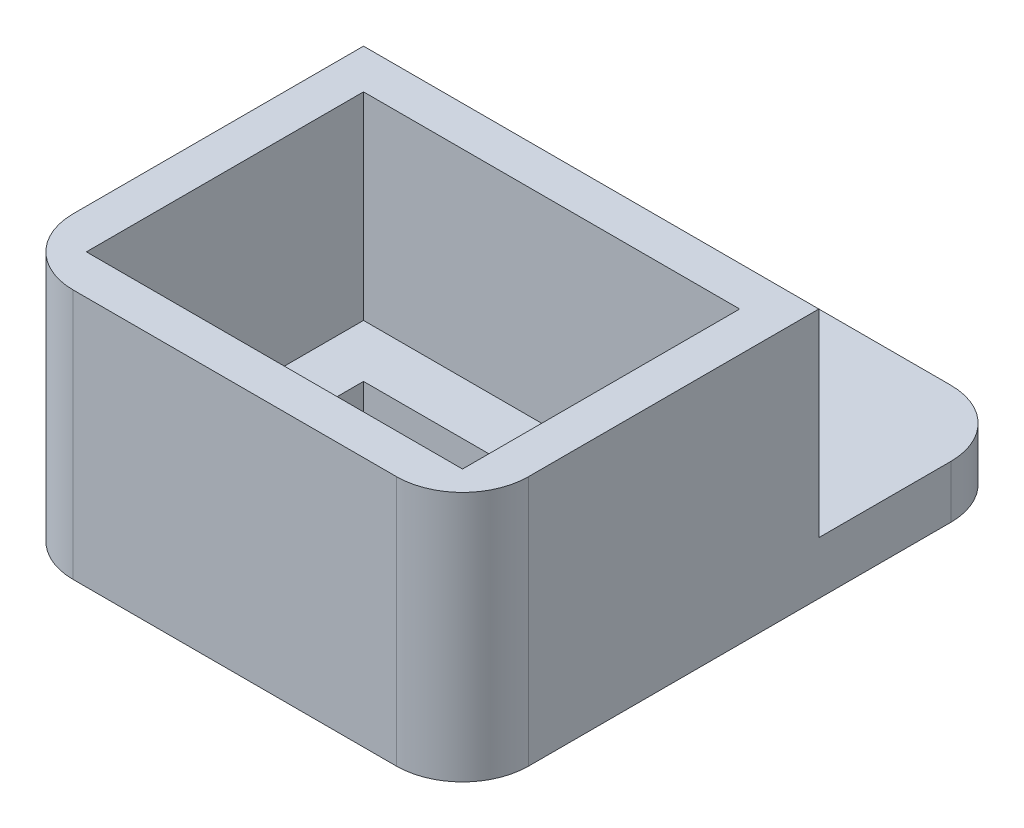
ISO-10303-21;
HEADER;
FILE_DESCRIPTION(('STEP AP214'),'2;1');
FILE_NAME('part.step','',(''),(''),'','','');
FILE_SCHEMA(('AUTOMOTIVE_DESIGN { 1 0 10303 214 1 1 1 1 }'));
ENDSEC;
DATA;
#1=APPLICATION_CONTEXT('core data for automotive mechanical design processes');
#2=APPLICATION_PROTOCOL_DEFINITION('international standard','automotive_design',2000,#1);
#3=PRODUCT_CONTEXT('',#1,'mechanical');
#4=PRODUCT('Part','Part','',(#3));
#5=PRODUCT_RELATED_PRODUCT_CATEGORY('part','',(#4));
#6=PRODUCT_DEFINITION_FORMATION('','',#4);
#7=PRODUCT_DEFINITION_CONTEXT('part definition',#1,'design');
#8=PRODUCT_DEFINITION('design','',#6,#7);
#9=PRODUCT_DEFINITION_SHAPE('','',#8);
#10=(LENGTH_UNIT() NAMED_UNIT(*) SI_UNIT(.MILLI.,.METRE.));
#11=(NAMED_UNIT(*) PLANE_ANGLE_UNIT() SI_UNIT($,.RADIAN.));
#12=(NAMED_UNIT(*) SI_UNIT($,.STERADIAN.) SOLID_ANGLE_UNIT());
#13=UNCERTAINTY_MEASURE_WITH_UNIT(LENGTH_MEASURE(1.E-05),#10,'distance_accuracy_value','');
#14=(GEOMETRIC_REPRESENTATION_CONTEXT(3) GLOBAL_UNCERTAINTY_ASSIGNED_CONTEXT((#13)) GLOBAL_UNIT_ASSIGNED_CONTEXT((#10,
#11,#12)) REPRESENTATION_CONTEXT('',''));
#15=CARTESIAN_POINT('',(0.,0.,0.));
#16=DIRECTION('',(0.,0.,1.));
#17=DIRECTION('',(1.,0.,0.));
#18=AXIS2_PLACEMENT_3D('',#15,#16,#17);
#19=CARTESIAN_POINT('',(0.,115.002,367.5));
#20=DIRECTION('',(0.,-1.,0.));
#21=DIRECTION('',(0.,0.,-1.));
#22=AXIS2_PLACEMENT_3D('',#19,#20,#21);
#23=CYLINDRICAL_SURFACE('',#22,1.65);
#24=CARTESIAN_POINT('',(0.,115.,367.5));
#25=DIRECTION('',(0.,1.,0.));
#26=DIRECTION('',(0.,0.,1.));
#27=AXIS2_PLACEMENT_3D('',#24,#25,#26);
#28=CIRCLE('',#27,1.65);
#29=CARTESIAN_POINT('',(0.,115.,369.15));
#30=VERTEX_POINT('',#29);
#31=EDGE_CURVE('E241',#30,#30,#28,.F.);
#32=ORIENTED_EDGE('',*,*,#31,.F.);
#33=EDGE_LOOP('',(#32));
#34=FACE_BOUND('',#33,.T.);
#35=CARTESIAN_POINT('',(0.,113.,367.5));
#36=DIRECTION('',(0.,-1.,0.));
#37=DIRECTION('',(1.,0.,0.));
#38=AXIS2_PLACEMENT_3D('',#35,#36,#37);
#39=CIRCLE('',#38,1.65);
#40=CARTESIAN_POINT('',(1.65000000000008,113.,367.5));
#41=VERTEX_POINT('',#40);
#42=EDGE_CURVE('E589',#41,#41,#39,.T.);
#43=ORIENTED_EDGE('',*,*,#42,.T.);
#44=EDGE_LOOP('',(#43));
#45=FACE_BOUND('',#44,.T.);
#46=ADVANCED_FACE('F16',(#34,#45),#23,.F.);
#47=CARTESIAN_POINT('',(0.,115.,381.));
#48=DIRECTION('',(0.,-1.,0.));
#49=DIRECTION('',(1.,0.,0.));
#50=AXIS2_PLACEMENT_3D('',#47,#48,#49);
#51=PLANE('',#50);
#52=DIRECTION('',(1.,0.,0.));
#53=VECTOR('',#52,1.);
#54=CARTESIAN_POINT('',(-3.51074537812937,115.,382.));
#55=LINE('',#54,#53);
#56=CARTESIAN_POINT('',(-10.25,115.,382.));
#57=VERTEX_POINT('',#56);
#58=CARTESIAN_POINT('',(10.25,115.,382.));
#59=VERTEX_POINT('',#58);
#60=EDGE_CURVE('E258',#57,#59,#55,.T.);
#61=ORIENTED_EDGE('',*,*,#60,.T.);
#62=DIRECTION('',(0.,0.,-1.));
#63=VECTOR('',#62,1.);
#64=CARTESIAN_POINT('',(10.25,115.,390.450173222865));
#65=LINE('',#64,#63);
#66=CARTESIAN_POINT('',(10.25,115.,395.));
#67=VERTEX_POINT('',#66);
#68=EDGE_CURVE('E313',#67,#59,#65,.T.);
#69=ORIENTED_EDGE('',*,*,#68,.F.);
#70=DIRECTION('',(1.,0.,0.));
#71=VECTOR('',#70,1.);
#72=CARTESIAN_POINT('',(-3.51074537812937,115.,395.));
#73=LINE('',#72,#71);
#74=CARTESIAN_POINT('',(-10.25,115.,395.));
#75=VERTEX_POINT('',#74);
#76=EDGE_CURVE('E309',#75,#67,#73,.T.);
#77=ORIENTED_EDGE('',*,*,#76,.F.);
#78=DIRECTION('',(0.,0.,-1.));
#79=VECTOR('',#78,1.);
#80=CARTESIAN_POINT('',(-10.25,115.,393.950173222865));
#81=LINE('',#80,#79);
#82=EDGE_CURVE('E305',#75,#57,#81,.T.);
#83=ORIENTED_EDGE('',*,*,#82,.T.);
#84=EDGE_LOOP('',(#61,#69,#77,#83));
#85=FACE_BOUND('',#84,.T.);
#86=DIRECTION('',(0.,0.,-1.));
#87=VECTOR('',#86,1.);
#88=CARTESIAN_POINT('',(-14.25,115.,392.5));
#89=LINE('',#88,#87);
#90=CARTESIAN_POINT('',(-14.25,115.,399.));
#91=VERTEX_POINT('',#90);
#92=CARTESIAN_POINT('',(-14.25,115.,378.));
#93=VERTEX_POINT('',#92);
#94=EDGE_CURVE('E240',#91,#93,#89,.T.);
#95=ORIENTED_EDGE('',*,*,#94,.F.);
#96=DIRECTION('',(1.,0.,0.));
#97=VECTOR('',#96,1.);
#98=CARTESIAN_POINT('',(-3.56886209920049,115.,399.));
#99=LINE('',#98,#97);
#100=CARTESIAN_POINT('',(14.25,115.,399.));
#101=VERTEX_POINT('',#100);
#102=EDGE_CURVE('E191',#91,#101,#99,.T.);
#103=ORIENTED_EDGE('',*,*,#102,.T.);
#104=DIRECTION('',(0.,0.,-1.));
#105=VECTOR('',#104,1.);
#106=CARTESIAN_POINT('',(14.25,115.,389.));
#107=LINE('',#106,#105);
#108=CARTESIAN_POINT('',(14.25,115.,378.));
#109=VERTEX_POINT('',#108);
#110=EDGE_CURVE('E244',#101,#109,#107,.T.);
#111=ORIENTED_EDGE('',*,*,#110,.T.);
#112=DIRECTION('',(1.,0.,0.));
#113=VECTOR('',#112,1.);
#114=CARTESIAN_POINT('',(-3.21599574801192,115.,378.));
#115=LINE('',#114,#113);
#116=EDGE_CURVE('E209',#93,#109,#115,.T.);
#117=ORIENTED_EDGE('',*,*,#116,.F.);
#118=EDGE_LOOP('',(#95,#103,#111,#117));
#119=FACE_BOUND('',#118,.T.);
#120=ADVANCED_FACE('F434',(#85,#119),#51,.F.);
#121=ORIENTED_EDGE('',*,*,#31,.T.);
#122=EDGE_LOOP('',(#121));
#123=FACE_BOUND('',#122,.T.);
#124=DIRECTION('',(0.,0.,-1.));
#125=VECTOR('',#124,1.);
#126=CARTESIAN_POINT('',(17.25,115.,389.));
#127=LINE('',#126,#125);
#128=CARTESIAN_POINT('',(17.25,115.,375.));
#129=VERTEX_POINT('',#128);
#130=CARTESIAN_POINT('',(17.25,115.,365.));
#131=VERTEX_POINT('',#130);
#132=EDGE_CURVE('E317',#129,#131,#127,.T.);
#133=ORIENTED_EDGE('',*,*,#132,.T.);
#134=CARTESIAN_POINT('',(12.25,115.,365.));
#135=DIRECTION('',(0.,-1.,0.));
#136=DIRECTION('',(0.,0.,-1.));
#137=AXIS2_PLACEMENT_3D('',#134,#135,#136);
#138=CIRCLE('',#137,5.);
#139=CARTESIAN_POINT('',(12.2500000000001,115.,360.));
#140=VERTEX_POINT('',#139);
#141=EDGE_CURVE('E49',#131,#140,#138,.F.);
#142=ORIENTED_EDGE('',*,*,#141,.T.);
#143=DIRECTION('',(-1.,0.,0.));
#144=VECTOR('',#143,1.);
#145=CARTESIAN_POINT('',(180.,115.,360.));
#146=LINE('',#145,#144);
#147=CARTESIAN_POINT('',(-12.2499999999999,115.,360.));
#148=VERTEX_POINT('',#147);
#149=EDGE_CURVE('E274',#140,#148,#146,.T.);
#150=ORIENTED_EDGE('',*,*,#149,.T.);
#151=CARTESIAN_POINT('',(-12.25,115.,365.));
#152=DIRECTION('',(0.,-1.,0.));
#153=DIRECTION('',(0.,0.,-1.));
#154=AXIS2_PLACEMENT_3D('',#151,#152,#153);
#155=CIRCLE('',#154,5.);
#156=CARTESIAN_POINT('',(-17.25,115.,365.));
#157=VERTEX_POINT('',#156);
#158=EDGE_CURVE('E37',#148,#157,#155,.F.);
#159=ORIENTED_EDGE('',*,*,#158,.T.);
#160=DIRECTION('',(0.,0.,-1.));
#161=VECTOR('',#160,1.);
#162=CARTESIAN_POINT('',(-17.25,115.,392.5));
#163=LINE('',#162,#161);
#164=CARTESIAN_POINT('',(-17.25,115.,375.));
#165=VERTEX_POINT('',#164);
#166=EDGE_CURVE('E320',#165,#157,#163,.T.);
#167=ORIENTED_EDGE('',*,*,#166,.F.);
#168=DIRECTION('',(-1.,0.,0.));
#169=VECTOR('',#168,1.);
#170=CARTESIAN_POINT('',(180.,115.,375.));
#171=LINE('',#170,#169);
#172=EDGE_CURVE('E247',#129,#165,#171,.T.);
#173=ORIENTED_EDGE('',*,*,#172,.F.);
#174=EDGE_LOOP('',(#133,#142,#150,#159,#167,#173));
#175=FACE_BOUND('',#174,.T.);
#176=ADVANCED_FACE('F387',(#123,#175),#51,.F.);
#177=CARTESIAN_POINT('',(-3.51074537812937,111.,382.));
#178=DIRECTION('',(0.,0.,1.));
#179=DIRECTION('',(1.,0.,0.));
#180=AXIS2_PLACEMENT_3D('',#177,#178,#179);
#181=PLANE('',#180);
#182=ORIENTED_EDGE('',*,*,#60,.F.);
#183=DIRECTION('',(0.,1.,0.));
#184=VECTOR('',#183,1.);
#185=CARTESIAN_POINT('',(-10.25,111.,382.));
#186=LINE('',#185,#184);
#187=CARTESIAN_POINT('',(-10.25,111.,382.));
#188=VERTEX_POINT('',#187);
#189=EDGE_CURVE('E335',#188,#57,#186,.T.);
#190=ORIENTED_EDGE('',*,*,#189,.F.);
#191=DIRECTION('',(1.,0.,0.));
#192=VECTOR('',#191,1.);
#193=CARTESIAN_POINT('',(-3.51074537812937,111.,382.));
#194=LINE('',#193,#192);
#195=CARTESIAN_POINT('',(10.25,111.,382.));
#196=VERTEX_POINT('',#195);
#197=EDGE_CURVE('E273',#188,#196,#194,.T.);
#198=ORIENTED_EDGE('',*,*,#197,.T.);
#199=DIRECTION('',(0.,1.,0.));
#200=VECTOR('',#199,1.);
#201=CARTESIAN_POINT('',(10.25,111.,382.));
#202=LINE('',#201,#200);
#203=EDGE_CURVE('E301',#196,#59,#202,.T.);
#204=ORIENTED_EDGE('',*,*,#203,.T.);
#205=EDGE_LOOP('',(#182,#190,#198,#204));
#206=FACE_BOUND('',#205,.T.);
#207=ADVANCED_FACE('F479',(#206),#181,.T.);
#208=CARTESIAN_POINT('',(-10.25,111.,393.950173222865));
#209=DIRECTION('',(1.,0.,0.));
#210=DIRECTION('',(0.,0.,-1.));
#211=AXIS2_PLACEMENT_3D('',#208,#209,#210);
#212=PLANE('',#211);
#213=ORIENTED_EDGE('',*,*,#82,.F.);
#214=DIRECTION('',(0.,1.,0.));
#215=VECTOR('',#214,1.);
#216=CARTESIAN_POINT('',(-10.25,111.,395.));
#217=LINE('',#216,#215);
#218=CARTESIAN_POINT('',(-10.25,111.,395.));
#219=VERTEX_POINT('',#218);
#220=EDGE_CURVE('E332',#219,#75,#217,.T.);
#221=ORIENTED_EDGE('',*,*,#220,.F.);
#222=DIRECTION('',(0.,0.,-1.));
#223=VECTOR('',#222,1.);
#224=CARTESIAN_POINT('',(-10.25,111.,393.950173222865));
#225=LINE('',#224,#223);
#226=EDGE_CURVE('E278',#219,#188,#225,.T.);
#227=ORIENTED_EDGE('',*,*,#226,.T.);
#228=ORIENTED_EDGE('',*,*,#189,.T.);
#229=EDGE_LOOP('',(#213,#221,#227,#228));
#230=FACE_BOUND('',#229,.T.);
#231=ADVANCED_FACE('F475',(#230),#212,.T.);
#232=CARTESIAN_POINT('',(-3.51074537812937,111.,395.));
#233=DIRECTION('',(0.,0.,1.));
#234=DIRECTION('',(0.,-1.,0.));
#235=AXIS2_PLACEMENT_3D('',#232,#233,#234);
#236=PLANE('',#235);
#237=ORIENTED_EDGE('',*,*,#76,.T.);
#238=DIRECTION('',(0.,1.,0.));
#239=VECTOR('',#238,1.);
#240=CARTESIAN_POINT('',(10.25,111.,395.));
#241=LINE('',#240,#239);
#242=CARTESIAN_POINT('',(10.25,111.,395.));
#243=VERTEX_POINT('',#242);
#244=EDGE_CURVE('E328',#243,#67,#241,.T.);
#245=ORIENTED_EDGE('',*,*,#244,.F.);
#246=DIRECTION('',(1.,0.,0.));
#247=VECTOR('',#246,1.);
#248=CARTESIAN_POINT('',(-3.51074537812937,111.,395.));
#249=LINE('',#248,#247);
#250=EDGE_CURVE('E282',#219,#243,#249,.T.);
#251=ORIENTED_EDGE('',*,*,#250,.F.);
#252=ORIENTED_EDGE('',*,*,#220,.T.);
#253=EDGE_LOOP('',(#237,#245,#251,#252));
#254=FACE_BOUND('',#253,.T.);
#255=ADVANCED_FACE('F472',(#254),#236,.F.);
#256=CARTESIAN_POINT('',(-3.56886209920049,111.,402.));
#257=DIRECTION('',(0.,0.,1.));
#258=DIRECTION('',(0.,-1.,0.));
#259=AXIS2_PLACEMENT_3D('',#256,#257,#258);
#260=PLANE('',#259);
#261=DIRECTION('',(1.,0.,0.));
#262=VECTOR('',#261,1.);
#263=CARTESIAN_POINT('',(-3.56886209920049,111.,402.));
#264=LINE('',#263,#262);
#265=CARTESIAN_POINT('',(-12.25,111.,402.));
#266=VERTEX_POINT('',#265);
#267=CARTESIAN_POINT('',(12.25,111.,402.));
#268=VERTEX_POINT('',#267);
#269=EDGE_CURVE('E269',#266,#268,#264,.T.);
#270=ORIENTED_EDGE('',*,*,#269,.T.);
#271=DIRECTION('',(0.,1.,0.));
#272=VECTOR('',#271,1.);
#273=CARTESIAN_POINT('',(12.25,111.,402.));
#274=LINE('',#273,#272);
#275=CARTESIAN_POINT('',(12.25,130.,402.));
#276=VERTEX_POINT('',#275);
#277=EDGE_CURVE('E341',#268,#276,#274,.T.);
#278=ORIENTED_EDGE('',*,*,#277,.T.);
#279=DIRECTION('',(1.,0.,0.));
#280=VECTOR('',#279,1.);
#281=CARTESIAN_POINT('',(-3.56886209920049,130.,402.));
#282=LINE('',#281,#280);
#283=CARTESIAN_POINT('',(-12.25,130.,402.));
#284=VERTEX_POINT('',#283);
#285=EDGE_CURVE('E208',#284,#276,#282,.T.);
#286=ORIENTED_EDGE('',*,*,#285,.F.);
#287=DIRECTION('',(0.,1.,0.));
#288=VECTOR('',#287,1.);
#289=CARTESIAN_POINT('',(-12.25,111.,402.));
#290=LINE('',#289,#288);
#291=EDGE_CURVE('E338',#284,#266,#290,.F.);
#292=ORIENTED_EDGE('',*,*,#291,.T.);
#293=EDGE_LOOP('',(#270,#278,#286,#292));
#294=FACE_BOUND('',#293,.T.);
#295=ADVANCED_FACE('F406',(#294),#260,.T.);
#296=CARTESIAN_POINT('',(-17.25,111.,392.5));
#297=DIRECTION('',(1.,0.,0.));
#298=DIRECTION('',(0.,0.,-1.));
#299=AXIS2_PLACEMENT_3D('',#296,#297,#298);
#300=PLANE('',#299);
#301=DIRECTION('',(0.,0.,-1.));
#302=VECTOR('',#301,1.);
#303=CARTESIAN_POINT('',(-17.25,111.,392.5));
#304=LINE('',#303,#302);
#305=CARTESIAN_POINT('',(-17.25,111.,397.));
#306=VERTEX_POINT('',#305);
#307=CARTESIAN_POINT('',(-17.25,111.,365.));
#308=VERTEX_POINT('',#307);
#309=EDGE_CURVE('E293',#306,#308,#304,.T.);
#310=ORIENTED_EDGE('',*,*,#309,.F.);
#311=DIRECTION('',(0.,1.,0.));
#312=VECTOR('',#311,1.);
#313=CARTESIAN_POINT('',(-17.25,130.,397.));
#314=LINE('',#313,#312);
#315=CARTESIAN_POINT('',(-17.25,130.,397.));
#316=VERTEX_POINT('',#315);
#317=EDGE_CURVE('E373',#306,#316,#314,.T.);
#318=ORIENTED_EDGE('',*,*,#317,.T.);
#319=DIRECTION('',(0.,0.,-1.));
#320=VECTOR('',#319,1.);
#321=CARTESIAN_POINT('',(-17.25,130.,392.5));
#322=LINE('',#321,#320);
#323=CARTESIAN_POINT('',(-17.25,130.,375.));
#324=VERTEX_POINT('',#323);
#325=EDGE_CURVE('E216',#316,#324,#322,.T.);
#326=ORIENTED_EDGE('',*,*,#325,.T.);
#327=DIRECTION('',(0.,-1.,0.));
#328=VECTOR('',#327,1.);
#329=CARTESIAN_POINT('',(-17.25,130.,375.));
#330=LINE('',#329,#328);
#331=EDGE_CURVE('E254',#324,#165,#330,.T.);
#332=ORIENTED_EDGE('',*,*,#331,.T.);
#333=ORIENTED_EDGE('',*,*,#166,.T.);
#334=DIRECTION('',(0.,1.,0.));
#335=VECTOR('',#334,1.);
#336=CARTESIAN_POINT('',(-17.25,111.,365.));
#337=LINE('',#336,#335);
#338=EDGE_CURVE('E370',#157,#308,#337,.F.);
#339=ORIENTED_EDGE('',*,*,#338,.T.);
#340=EDGE_LOOP('',(#310,#318,#326,#332,#333,#339));
#341=FACE_BOUND('',#340,.T.);
#342=ADVANCED_FACE('F390',(#341),#300,.F.);
#343=CARTESIAN_POINT('',(180.,111.,360.));
#344=DIRECTION('',(0.,0.,-1.));
#345=DIRECTION('',(0.,1.,0.));
#346=AXIS2_PLACEMENT_3D('',#343,#344,#345);
#347=PLANE('',#346);
#348=ORIENTED_EDGE('',*,*,#149,.F.);
#349=DIRECTION('',(0.,1.,0.));
#350=VECTOR('',#349,1.);
#351=CARTESIAN_POINT('',(12.25,111.,360.));
#352=LINE('',#351,#350);
#353=CARTESIAN_POINT('',(12.2500000000001,111.,360.));
#354=VERTEX_POINT('',#353);
#355=EDGE_CURVE('E10',#140,#354,#352,.F.);
#356=ORIENTED_EDGE('',*,*,#355,.T.);
#357=DIRECTION('',(-1.,0.,0.));
#358=VECTOR('',#357,1.);
#359=CARTESIAN_POINT('',(180.,111.,360.));
#360=LINE('',#359,#358);
#361=CARTESIAN_POINT('',(-12.2499999999999,111.,360.));
#362=VERTEX_POINT('',#361);
#363=EDGE_CURVE('E297',#354,#362,#360,.T.);
#364=ORIENTED_EDGE('',*,*,#363,.T.);
#365=DIRECTION('',(0.,1.,0.));
#366=VECTOR('',#365,1.);
#367=CARTESIAN_POINT('',(-12.25,115.,360.));
#368=LINE('',#367,#366);
#369=EDGE_CURVE('E25',#362,#148,#368,.T.);
#370=ORIENTED_EDGE('',*,*,#369,.T.);
#371=EDGE_LOOP('',(#348,#356,#364,#370));
#372=FACE_BOUND('',#371,.T.);
#373=ADVANCED_FACE('F383',(#372),#347,.T.);
#374=CARTESIAN_POINT('',(17.25,111.,389.));
#375=DIRECTION('',(1.,0.,0.));
#376=DIRECTION('',(0.,0.,-1.));
#377=AXIS2_PLACEMENT_3D('',#374,#375,#376);
#378=PLANE('',#377);
#379=DIRECTION('',(0.,0.,-1.));
#380=VECTOR('',#379,1.);
#381=CARTESIAN_POINT('',(17.25,130.,389.));
#382=LINE('',#381,#380);
#383=CARTESIAN_POINT('',(17.25,130.,397.));
#384=VERTEX_POINT('',#383);
#385=CARTESIAN_POINT('',(17.25,130.,375.));
#386=VERTEX_POINT('',#385);
#387=EDGE_CURVE('E229',#384,#386,#382,.T.);
#388=ORIENTED_EDGE('',*,*,#387,.F.);
#389=DIRECTION('',(0.,1.,0.));
#390=VECTOR('',#389,1.);
#391=CARTESIAN_POINT('',(17.25,111.,397.));
#392=LINE('',#391,#390);
#393=CARTESIAN_POINT('',(17.25,111.,397.));
#394=VERTEX_POINT('',#393);
#395=EDGE_CURVE('E355',#384,#394,#392,.F.);
#396=ORIENTED_EDGE('',*,*,#395,.T.);
#397=DIRECTION('',(0.,0.,-1.));
#398=VECTOR('',#397,1.);
#399=CARTESIAN_POINT('',(17.25,111.,389.));
#400=LINE('',#399,#398);
#401=CARTESIAN_POINT('',(17.25,111.,365.));
#402=VERTEX_POINT('',#401);
#403=EDGE_CURVE('E289',#394,#402,#400,.T.);
#404=ORIENTED_EDGE('',*,*,#403,.T.);
#405=DIRECTION('',(0.,1.,0.));
#406=VECTOR('',#405,1.);
#407=CARTESIAN_POINT('',(17.25,111.,365.));
#408=LINE('',#407,#406);
#409=EDGE_CURVE('E351',#402,#131,#408,.T.);
#410=ORIENTED_EDGE('',*,*,#409,.T.);
#411=ORIENTED_EDGE('',*,*,#132,.F.);
#412=DIRECTION('',(0.,-1.,0.));
#413=VECTOR('',#412,1.);
#414=CARTESIAN_POINT('',(17.25,130.,375.));
#415=LINE('',#414,#413);
#416=EDGE_CURVE('E196',#386,#129,#415,.T.);
#417=ORIENTED_EDGE('',*,*,#416,.F.);
#418=EDGE_LOOP('',(#388,#396,#404,#410,#411,#417));
#419=FACE_BOUND('',#418,.T.);
#420=ADVANCED_FACE('F415',(#419),#378,.T.);
#421=CARTESIAN_POINT('',(10.25,111.,390.450173222865));
#422=DIRECTION('',(1.,0.,0.));
#423=DIRECTION('',(0.,0.,-1.));
#424=AXIS2_PLACEMENT_3D('',#421,#422,#423);
#425=PLANE('',#424);
#426=ORIENTED_EDGE('',*,*,#68,.T.);
#427=ORIENTED_EDGE('',*,*,#203,.F.);
#428=DIRECTION('',(0.,0.,-1.));
#429=VECTOR('',#428,1.);
#430=CARTESIAN_POINT('',(10.25,111.,390.450173222865));
#431=LINE('',#430,#429);
#432=EDGE_CURVE('E286',#243,#196,#431,.T.);
#433=ORIENTED_EDGE('',*,*,#432,.F.);
#434=ORIENTED_EDGE('',*,*,#244,.T.);
#435=EDGE_LOOP('',(#426,#427,#433,#434));
#436=FACE_BOUND('',#435,.T.);
#437=ADVANCED_FACE('F428',(#436),#425,.F.);
#438=CARTESIAN_POINT('',(0.,111.,381.));
#439=DIRECTION('',(0.,-1.,0.));
#440=DIRECTION('',(1.,0.,0.));
#441=AXIS2_PLACEMENT_3D('',#438,#439,#440);
#442=PLANE('',#441);
#443=CARTESIAN_POINT('',(0.,111.,367.5));
#444=DIRECTION('',(0.,-1.,0.));
#445=DIRECTION('',(1.,0.,0.));
#446=AXIS2_PLACEMENT_3D('',#443,#444,#445);
#447=CIRCLE('',#446,3.);
#448=CARTESIAN_POINT('',(3.00000000000008,111.,367.5));
#449=VERTEX_POINT('',#448);
#450=EDGE_CURVE('E585',#449,#449,#447,.T.);
#451=ORIENTED_EDGE('',*,*,#450,.F.);
#452=EDGE_LOOP('',(#451));
#453=FACE_BOUND('',#452,.T.);
#454=ORIENTED_EDGE('',*,*,#403,.F.);
#455=CARTESIAN_POINT('',(12.25,111.,397.));
#456=DIRECTION('',(0.,-1.,0.));
#457=DIRECTION('',(0.,0.,-1.));
#458=AXIS2_PLACEMENT_3D('',#455,#456,#457);
#459=CIRCLE('',#458,5.);
#460=EDGE_CURVE('E367',#394,#268,#459,.T.);
#461=ORIENTED_EDGE('',*,*,#460,.T.);
#462=ORIENTED_EDGE('',*,*,#269,.F.);
#463=CARTESIAN_POINT('',(-12.25,111.,397.));
#464=DIRECTION('',(0.,-1.,0.));
#465=DIRECTION('',(0.,0.,-1.));
#466=AXIS2_PLACEMENT_3D('',#463,#464,#465);
#467=CIRCLE('',#466,5.);
#468=EDGE_CURVE('E364',#266,#306,#467,.T.);
#469=ORIENTED_EDGE('',*,*,#468,.T.);
#470=ORIENTED_EDGE('',*,*,#309,.T.);
#471=CARTESIAN_POINT('',(-12.25,111.,365.));
#472=DIRECTION('',(0.,-1.,0.));
#473=DIRECTION('',(0.,0.,-1.));
#474=AXIS2_PLACEMENT_3D('',#471,#472,#473);
#475=CIRCLE('',#474,5.);
#476=EDGE_CURVE('E358',#308,#362,#475,.T.);
#477=ORIENTED_EDGE('',*,*,#476,.T.);
#478=ORIENTED_EDGE('',*,*,#363,.F.);
#479=CARTESIAN_POINT('',(12.25,111.,365.));
#480=DIRECTION('',(0.,-1.,0.));
#481=DIRECTION('',(0.,0.,-1.));
#482=AXIS2_PLACEMENT_3D('',#479,#480,#481);
#483=CIRCLE('',#482,5.);
#484=EDGE_CURVE('E361',#354,#402,#483,.T.);
#485=ORIENTED_EDGE('',*,*,#484,.T.);
#486=EDGE_LOOP('',(#454,#461,#462,#469,#470,#477,#478,#485));
#487=FACE_BOUND('',#486,.T.);
#488=ORIENTED_EDGE('',*,*,#197,.F.);
#489=ORIENTED_EDGE('',*,*,#226,.F.);
#490=ORIENTED_EDGE('',*,*,#250,.T.);
#491=ORIENTED_EDGE('',*,*,#432,.T.);
#492=EDGE_LOOP('',(#488,#489,#490,#491));
#493=FACE_BOUND('',#492,.T.);
#494=ADVANCED_FACE('F394',(#453,#487,#493),#442,.T.);
#495=CARTESIAN_POINT('',(180.,130.,375.));
#496=DIRECTION('',(0.,0.,1.));
#497=DIRECTION('',(0.,-1.,0.));
#498=AXIS2_PLACEMENT_3D('',#495,#496,#497);
#499=PLANE('',#498);
#500=ORIENTED_EDGE('',*,*,#172,.T.);
#501=ORIENTED_EDGE('',*,*,#331,.F.);
#502=DIRECTION('',(-1.,0.,0.));
#503=VECTOR('',#502,1.);
#504=CARTESIAN_POINT('',(180.,130.,375.));
#505=LINE('',#504,#503);
#506=EDGE_CURVE('E232',#386,#324,#505,.T.);
#507=ORIENTED_EDGE('',*,*,#506,.F.);
#508=ORIENTED_EDGE('',*,*,#416,.T.);
#509=EDGE_LOOP('',(#500,#501,#507,#508));
#510=FACE_BOUND('',#509,.T.);
#511=ADVANCED_FACE('F419',(#510),#499,.F.);
#512=CARTESIAN_POINT('',(-14.25,130.,392.5));
#513=DIRECTION('',(-1.,0.,0.));
#514=DIRECTION('',(0.,0.,1.));
#515=AXIS2_PLACEMENT_3D('',#512,#513,#514);
#516=PLANE('',#515);
#517=ORIENTED_EDGE('',*,*,#94,.T.);
#518=DIRECTION('',(0.,-1.,0.));
#519=VECTOR('',#518,1.);
#520=CARTESIAN_POINT('',(-14.25,130.,378.));
#521=LINE('',#520,#519);
#522=CARTESIAN_POINT('',(-14.25,130.,378.));
#523=VERTEX_POINT('',#522);
#524=EDGE_CURVE('E213',#523,#93,#521,.T.);
#525=ORIENTED_EDGE('',*,*,#524,.F.);
#526=DIRECTION('',(0.,0.,-1.));
#527=VECTOR('',#526,1.);
#528=CARTESIAN_POINT('',(-14.25,130.,392.5));
#529=LINE('',#528,#527);
#530=CARTESIAN_POINT('',(-14.25,130.,399.));
#531=VERTEX_POINT('',#530);
#532=EDGE_CURVE('E204',#531,#523,#529,.T.);
#533=ORIENTED_EDGE('',*,*,#532,.F.);
#534=DIRECTION('',(0.,-1.,0.));
#535=VECTOR('',#534,1.);
#536=CARTESIAN_POINT('',(-14.25,130.,399.));
#537=LINE('',#536,#535);
#538=EDGE_CURVE('E185',#531,#91,#537,.T.);
#539=ORIENTED_EDGE('',*,*,#538,.T.);
#540=EDGE_LOOP('',(#517,#525,#533,#539));
#541=FACE_BOUND('',#540,.T.);
#542=ADVANCED_FACE('F211',(#541),#516,.F.);
#543=CARTESIAN_POINT('',(-3.56886209920049,130.,399.));
#544=DIRECTION('',(0.,0.,-1.));
#545=DIRECTION('',(0.,1.,0.));
#546=AXIS2_PLACEMENT_3D('',#543,#544,#545);
#547=PLANE('',#546);
#548=ORIENTED_EDGE('',*,*,#102,.F.);
#549=ORIENTED_EDGE('',*,*,#538,.F.);
#550=DIRECTION('',(1.,0.,0.));
#551=VECTOR('',#550,1.);
#552=CARTESIAN_POINT('',(-3.56886209920049,130.,399.));
#553=LINE('',#552,#551);
#554=CARTESIAN_POINT('',(14.25,130.,399.));
#555=VERTEX_POINT('',#554);
#556=EDGE_CURVE('E189',#531,#555,#553,.T.);
#557=ORIENTED_EDGE('',*,*,#556,.T.);
#558=DIRECTION('',(0.,-1.,0.));
#559=VECTOR('',#558,1.);
#560=CARTESIAN_POINT('',(14.25,130.,399.));
#561=LINE('',#560,#559);
#562=EDGE_CURVE('E197',#555,#101,#561,.T.);
#563=ORIENTED_EDGE('',*,*,#562,.T.);
#564=EDGE_LOOP('',(#548,#549,#557,#563));
#565=FACE_BOUND('',#564,.T.);
#566=ADVANCED_FACE('F187',(#565),#547,.T.);
#567=CARTESIAN_POINT('',(14.25,130.,389.));
#568=DIRECTION('',(-1.,0.,0.));
#569=DIRECTION('',(0.,0.,1.));
#570=AXIS2_PLACEMENT_3D('',#567,#568,#569);
#571=PLANE('',#570);
#572=ORIENTED_EDGE('',*,*,#110,.F.);
#573=ORIENTED_EDGE('',*,*,#562,.F.);
#574=DIRECTION('',(0.,0.,-1.));
#575=VECTOR('',#574,1.);
#576=CARTESIAN_POINT('',(14.25,130.,389.));
#577=LINE('',#576,#575);
#578=CARTESIAN_POINT('',(14.25,130.,378.));
#579=VERTEX_POINT('',#578);
#580=EDGE_CURVE('E206',#555,#579,#577,.T.);
#581=ORIENTED_EDGE('',*,*,#580,.T.);
#582=DIRECTION('',(0.,-1.,0.));
#583=VECTOR('',#582,1.);
#584=CARTESIAN_POINT('',(14.25,130.,378.));
#585=LINE('',#584,#583);
#586=EDGE_CURVE('E262',#579,#109,#585,.T.);
#587=ORIENTED_EDGE('',*,*,#586,.T.);
#588=EDGE_LOOP('',(#572,#573,#581,#587));
#589=FACE_BOUND('',#588,.T.);
#590=ADVANCED_FACE('F450',(#589),#571,.T.);
#591=CARTESIAN_POINT('',(-3.21599574801192,130.,378.));
#592=DIRECTION('',(0.,0.,-1.));
#593=DIRECTION('',(0.,1.,0.));
#594=AXIS2_PLACEMENT_3D('',#591,#592,#593);
#595=PLANE('',#594);
#596=ORIENTED_EDGE('',*,*,#116,.T.);
#597=ORIENTED_EDGE('',*,*,#586,.F.);
#598=DIRECTION('',(1.,0.,0.));
#599=VECTOR('',#598,1.);
#600=CARTESIAN_POINT('',(-3.21599574801192,130.,378.));
#601=LINE('',#600,#599);
#602=EDGE_CURVE('E236',#523,#579,#601,.T.);
#603=ORIENTED_EDGE('',*,*,#602,.F.);
#604=ORIENTED_EDGE('',*,*,#524,.T.);
#605=EDGE_LOOP('',(#596,#597,#603,#604));
#606=FACE_BOUND('',#605,.T.);
#607=ADVANCED_FACE('F448',(#606),#595,.F.);
#608=CARTESIAN_POINT('',(0.,130.,381.));
#609=DIRECTION('',(0.,-1.,0.));
#610=DIRECTION('',(1.,0.,0.));
#611=AXIS2_PLACEMENT_3D('',#608,#609,#610);
#612=PLANE('',#611);
#613=ORIENTED_EDGE('',*,*,#532,.T.);
#614=ORIENTED_EDGE('',*,*,#602,.T.);
#615=ORIENTED_EDGE('',*,*,#580,.F.);
#616=ORIENTED_EDGE('',*,*,#556,.F.);
#617=EDGE_LOOP('',(#613,#614,#615,#616));
#618=FACE_BOUND('',#617,.T.);
#619=ORIENTED_EDGE('',*,*,#285,.T.);
#620=CARTESIAN_POINT('',(12.25,130.,397.));
#621=DIRECTION('',(0.,-1.,0.));
#622=DIRECTION('',(0.,0.,-1.));
#623=AXIS2_PLACEMENT_3D('',#620,#621,#622);
#624=CIRCLE('',#623,5.);
#625=EDGE_CURVE('E348',#276,#384,#624,.F.);
#626=ORIENTED_EDGE('',*,*,#625,.T.);
#627=ORIENTED_EDGE('',*,*,#387,.T.);
#628=ORIENTED_EDGE('',*,*,#506,.T.);
#629=ORIENTED_EDGE('',*,*,#325,.F.);
#630=CARTESIAN_POINT('',(-12.25,130.,397.));
#631=DIRECTION('',(0.,-1.,0.));
#632=DIRECTION('',(0.,0.,-1.));
#633=AXIS2_PLACEMENT_3D('',#630,#631,#632);
#634=CIRCLE('',#633,5.);
#635=EDGE_CURVE('E345',#316,#284,#634,.F.);
#636=ORIENTED_EDGE('',*,*,#635,.T.);
#637=EDGE_LOOP('',(#619,#626,#627,#628,#629,#636));
#638=FACE_BOUND('',#637,.T.);
#639=ADVANCED_FACE('F201',(#618,#638),#612,.F.);
#640=CARTESIAN_POINT('',(0.,113.,367.5));
#641=DIRECTION('',(0.,-1.,0.));
#642=DIRECTION('',(0.,0.,-1.));
#643=AXIS2_PLACEMENT_3D('',#640,#641,#642);
#644=CYLINDRICAL_SURFACE('',#643,3.);
#645=CARTESIAN_POINT('',(0.,113.,367.5));
#646=DIRECTION('',(0.,-1.,0.));
#647=DIRECTION('',(1.,0.,0.));
#648=AXIS2_PLACEMENT_3D('',#645,#646,#647);
#649=CIRCLE('',#648,3.);
#650=CARTESIAN_POINT('',(3.00000000000008,113.,367.5));
#651=VERTEX_POINT('',#650);
#652=EDGE_CURVE('E583',#651,#651,#649,.T.);
#653=ORIENTED_EDGE('',*,*,#652,.F.);
#654=EDGE_LOOP('',(#653));
#655=FACE_BOUND('',#654,.T.);
#656=ORIENTED_EDGE('',*,*,#450,.T.);
#657=EDGE_LOOP('',(#656));
#658=FACE_BOUND('',#657,.T.);
#659=ADVANCED_FACE('F445',(#655,#658),#644,.F.);
#660=CARTESIAN_POINT('',(1.14491749414469E-13,113.,381.));
#661=DIRECTION('',(0.,-1.,0.));
#662=DIRECTION('',(1.,0.,0.));
#663=AXIS2_PLACEMENT_3D('',#660,#661,#662);
#664=PLANE('',#663);
#665=ORIENTED_EDGE('',*,*,#42,.F.);
#666=EDGE_LOOP('',(#665));
#667=FACE_BOUND('',#666,.T.);
#668=ORIENTED_EDGE('',*,*,#652,.T.);
#669=EDGE_LOOP('',(#668));
#670=FACE_BOUND('',#669,.T.);
#671=ADVANCED_FACE('F488',(#667,#670),#664,.T.);
#672=CARTESIAN_POINT('',(12.25,111.,397.));
#673=DIRECTION('',(0.,1.,0.));
#674=DIRECTION('',(0.,0.,1.));
#675=AXIS2_PLACEMENT_3D('',#672,#673,#674);
#676=CYLINDRICAL_SURFACE('',#675,5.);
#677=ORIENTED_EDGE('',*,*,#460,.F.);
#678=ORIENTED_EDGE('',*,*,#395,.F.);
#679=ORIENTED_EDGE('',*,*,#625,.F.);
#680=ORIENTED_EDGE('',*,*,#277,.F.);
#681=EDGE_LOOP('',(#677,#678,#679,#680));
#682=FACE_BOUND('',#681,.T.);
#683=ADVANCED_FACE('F410',(#682),#676,.T.);
#684=CARTESIAN_POINT('',(-12.25,111.,397.));
#685=DIRECTION('',(0.,-1.,0.));
#686=DIRECTION('',(0.,0.,-1.));
#687=AXIS2_PLACEMENT_3D('',#684,#685,#686);
#688=CYLINDRICAL_SURFACE('',#687,5.);
#689=ORIENTED_EDGE('',*,*,#468,.F.);
#690=ORIENTED_EDGE('',*,*,#291,.F.);
#691=ORIENTED_EDGE('',*,*,#635,.F.);
#692=ORIENTED_EDGE('',*,*,#317,.F.);
#693=EDGE_LOOP('',(#689,#690,#691,#692));
#694=FACE_BOUND('',#693,.T.);
#695=ADVANCED_FACE('F402',(#694),#688,.T.);
#696=CARTESIAN_POINT('',(12.25,111.,365.));
#697=DIRECTION('',(0.,1.,0.));
#698=DIRECTION('',(0.,0.,1.));
#699=AXIS2_PLACEMENT_3D('',#696,#697,#698);
#700=CYLINDRICAL_SURFACE('',#699,5.);
#701=ORIENTED_EDGE('',*,*,#484,.F.);
#702=ORIENTED_EDGE('',*,*,#355,.F.);
#703=ORIENTED_EDGE('',*,*,#141,.F.);
#704=ORIENTED_EDGE('',*,*,#409,.F.);
#705=EDGE_LOOP('',(#701,#702,#703,#704));
#706=FACE_BOUND('',#705,.T.);
#707=ADVANCED_FACE('F490',(#706),#700,.T.);
#708=CARTESIAN_POINT('',(-12.25,111.,365.));
#709=DIRECTION('',(0.,-1.,0.));
#710=DIRECTION('',(0.,0.,-1.));
#711=AXIS2_PLACEMENT_3D('',#708,#709,#710);
#712=CYLINDRICAL_SURFACE('',#711,5.);
#713=ORIENTED_EDGE('',*,*,#476,.F.);
#714=ORIENTED_EDGE('',*,*,#338,.F.);
#715=ORIENTED_EDGE('',*,*,#158,.F.);
#716=ORIENTED_EDGE('',*,*,#369,.F.);
#717=EDGE_LOOP('',(#713,#714,#715,#716));
#718=FACE_BOUND('',#717,.T.);
#719=ADVANCED_FACE('F18',(#718),#712,.T.);
#720=CLOSED_SHELL('',(#46,#120,#176,#207,#231,#255,#295,#342,#373,#420,#437,#494,#511,#542,#566,
#590,#607,#639,#659,#671,#683,#695,#707,#719));
#721=MANIFOLD_SOLID_BREP('B1',#720);
#722=ADVANCED_BREP_SHAPE_REPRESENTATION('',(#18,#721),#14);
#723=SHAPE_DEFINITION_REPRESENTATION(#9,#722);
ENDSEC;
END-ISO-10303-21;
